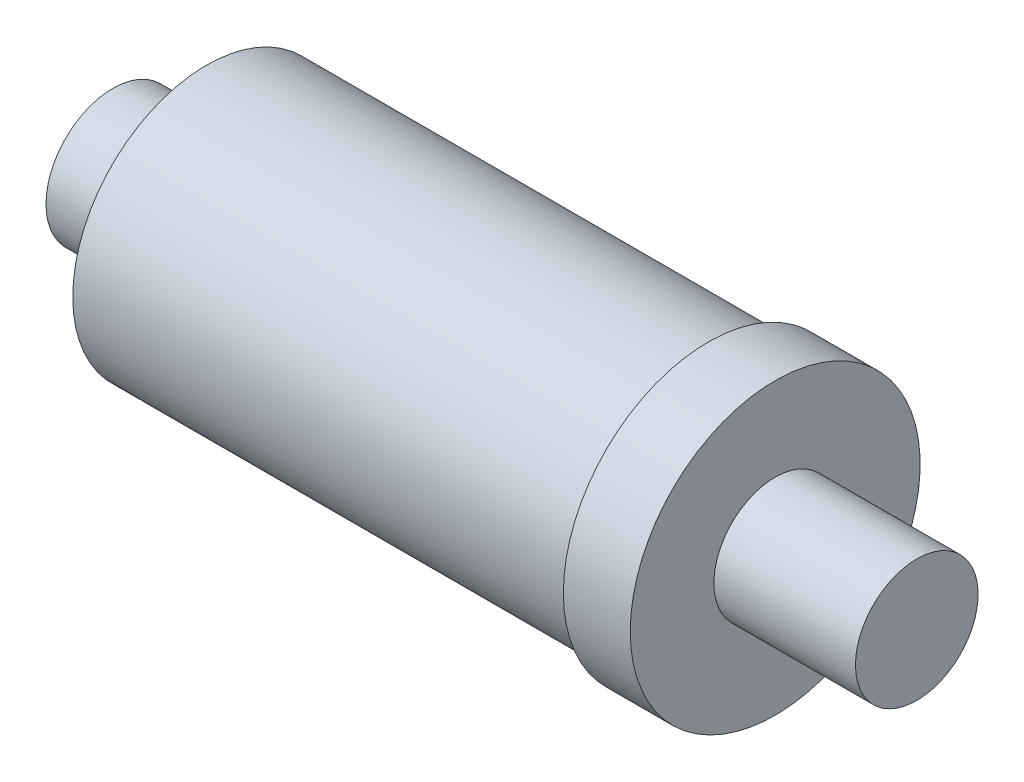
ISO-10303-21;
HEADER;
FILE_DESCRIPTION(('STEP AP214'),'2;1');
FILE_NAME('part.step','',(''),(''),'','','');
FILE_SCHEMA(('AUTOMOTIVE_DESIGN { 1 0 10303 214 1 1 1 1 }'));
ENDSEC;
DATA;
#1=APPLICATION_CONTEXT('core data for automotive mechanical design processes');
#2=APPLICATION_PROTOCOL_DEFINITION('international standard','automotive_design',2000,#1);
#3=PRODUCT_CONTEXT('',#1,'mechanical');
#4=PRODUCT('Part','Part','',(#3));
#5=PRODUCT_RELATED_PRODUCT_CATEGORY('part','',(#4));
#6=PRODUCT_DEFINITION_FORMATION('','',#4);
#7=PRODUCT_DEFINITION_CONTEXT('part definition',#1,'design');
#8=PRODUCT_DEFINITION('design','',#6,#7);
#9=PRODUCT_DEFINITION_SHAPE('','',#8);
#10=(LENGTH_UNIT() NAMED_UNIT(*) SI_UNIT(.MILLI.,.METRE.));
#11=(NAMED_UNIT(*) PLANE_ANGLE_UNIT() SI_UNIT($,.RADIAN.));
#12=(NAMED_UNIT(*) SI_UNIT($,.STERADIAN.) SOLID_ANGLE_UNIT());
#13=UNCERTAINTY_MEASURE_WITH_UNIT(LENGTH_MEASURE(1.E-05),#10,'distance_accuracy_value','');
#14=(GEOMETRIC_REPRESENTATION_CONTEXT(3) GLOBAL_UNCERTAINTY_ASSIGNED_CONTEXT((#13)) GLOBAL_UNIT_ASSIGNED_CONTEXT((#10,
#11,#12)) REPRESENTATION_CONTEXT('',''));
#15=CARTESIAN_POINT('',(0.,0.,0.));
#16=DIRECTION('',(0.,0.,1.));
#17=DIRECTION('',(1.,0.,0.));
#18=AXIS2_PLACEMENT_3D('',#15,#16,#17);
#19=CARTESIAN_POINT('',(12.7,0.,0.));
#20=DIRECTION('',(-1.,0.,0.));
#21=DIRECTION('',(0.,0.,1.));
#22=AXIS2_PLACEMENT_3D('',#19,#20,#21);
#23=PLANE('',#22);
#24=CARTESIAN_POINT('',(12.6999999999999,0.,0.));
#25=DIRECTION('',(-1.,0.,0.));
#26=DIRECTION('',(0.,0.,1.));
#27=AXIS2_PLACEMENT_3D('',#24,#25,#26);
#28=CIRCLE('',#27,5.5);
#29=CARTESIAN_POINT('',(12.6999999999999,0.,5.5));
#30=VERTEX_POINT('',#29);
#31=EDGE_CURVE('E10',#30,#30,#28,.T.);
#32=ORIENTED_EDGE('',*,*,#31,.F.);
#33=EDGE_LOOP('',(#32));
#34=FACE_BOUND('',#33,.T.);
#35=ADVANCED_FACE('F39',(#34),#23,.F.);
#36=CARTESIAN_POINT('',(-1000.,0.,0.));
#37=DIRECTION('',(-1.,0.,0.));
#38=DIRECTION('',(0.,0.,1.));
#39=AXIS2_PLACEMENT_3D('',#36,#37,#38);
#40=CYLINDRICAL_SURFACE('',#39,5.5);
#41=CARTESIAN_POINT('',(0.,0.,0.));
#42=DIRECTION('',(-1.,0.,0.));
#43=DIRECTION('',(0.,0.,1.));
#44=AXIS2_PLACEMENT_3D('',#41,#42,#43);
#45=CIRCLE('',#44,5.5);
#46=CARTESIAN_POINT('',(0.,0.,5.5));
#47=VERTEX_POINT('',#46);
#48=EDGE_CURVE('E44',#47,#47,#45,.T.);
#49=ORIENTED_EDGE('',*,*,#48,.F.);
#50=EDGE_LOOP('',(#49));
#51=FACE_BOUND('',#50,.T.);
#52=ORIENTED_EDGE('',*,*,#31,.T.);
#53=EDGE_LOOP('',(#52));
#54=FACE_BOUND('',#53,.T.);
#55=ADVANCED_FACE('F104',(#51,#54),#40,.T.);
#56=CARTESIAN_POINT('',(0.,5.5,0.));
#57=DIRECTION('',(-1.,0.,0.));
#58=DIRECTION('',(0.,0.,1.));
#59=AXIS2_PLACEMENT_3D('',#56,#57,#58);
#60=PLANE('',#59);
#61=CARTESIAN_POINT('',(0.,0.,0.));
#62=DIRECTION('',(-1.,0.,0.));
#63=DIRECTION('',(0.,0.,1.));
#64=AXIS2_PLACEMENT_3D('',#61,#62,#63);
#65=CIRCLE('',#64,13.);
#66=CARTESIAN_POINT('',(0.,0.,13.));
#67=VERTEX_POINT('',#66);
#68=EDGE_CURVE('E47',#67,#67,#65,.T.);
#69=ORIENTED_EDGE('',*,*,#68,.F.);
#70=EDGE_LOOP('',(#69));
#71=FACE_BOUND('',#70,.T.);
#72=ORIENTED_EDGE('',*,*,#48,.T.);
#73=EDGE_LOOP('',(#72));
#74=FACE_BOUND('',#73,.T.);
#75=ADVANCED_FACE('F99',(#71,#74),#60,.F.);
#76=CARTESIAN_POINT('',(-1000.,0.,0.));
#77=DIRECTION('',(-1.,0.,0.));
#78=DIRECTION('',(0.,0.,1.));
#79=AXIS2_PLACEMENT_3D('',#76,#77,#78);
#80=CYLINDRICAL_SURFACE('',#79,13.);
#81=CARTESIAN_POINT('',(-6.00000000000001,0.,0.));
#82=DIRECTION('',(-1.,0.,0.));
#83=DIRECTION('',(0.,0.,1.));
#84=AXIS2_PLACEMENT_3D('',#81,#82,#83);
#85=CIRCLE('',#84,13.);
#86=CARTESIAN_POINT('',(-6.00000000000001,0.,13.));
#87=VERTEX_POINT('',#86);
#88=EDGE_CURVE('E52',#87,#87,#85,.T.);
#89=ORIENTED_EDGE('',*,*,#88,.F.);
#90=EDGE_LOOP('',(#89));
#91=FACE_BOUND('',#90,.T.);
#92=ORIENTED_EDGE('',*,*,#68,.T.);
#93=EDGE_LOOP('',(#92));
#94=FACE_BOUND('',#93,.T.);
#95=ADVANCED_FACE('F94',(#91,#94),#80,.T.);
#96=CARTESIAN_POINT('',(-6.,13.,0.));
#97=DIRECTION('',(1.,0.,0.));
#98=DIRECTION('',(0.,0.,-1.));
#99=AXIS2_PLACEMENT_3D('',#96,#97,#98);
#100=PLANE('',#99);
#101=CARTESIAN_POINT('',(-6.00000000000001,0.,0.));
#102=DIRECTION('',(-1.,0.,0.));
#103=DIRECTION('',(0.,0.,1.));
#104=AXIS2_PLACEMENT_3D('',#101,#102,#103);
#105=CIRCLE('',#104,12.);
#106=CARTESIAN_POINT('',(-6.00000000000001,0.,12.));
#107=VERTEX_POINT('',#106);
#108=EDGE_CURVE('E59',#107,#107,#105,.T.);
#109=ORIENTED_EDGE('',*,*,#108,.F.);
#110=EDGE_LOOP('',(#109));
#111=FACE_BOUND('',#110,.T.);
#112=ORIENTED_EDGE('',*,*,#88,.T.);
#113=EDGE_LOOP('',(#112));
#114=FACE_BOUND('',#113,.T.);
#115=ADVANCED_FACE('F86',(#111,#114),#100,.F.);
#116=CARTESIAN_POINT('',(-1000.,0.,0.));
#117=DIRECTION('',(-1.,0.,0.));
#118=DIRECTION('',(0.,0.,1.));
#119=AXIS2_PLACEMENT_3D('',#116,#117,#118);
#120=CYLINDRICAL_SURFACE('',#119,12.);
#121=CARTESIAN_POINT('',(-51.,0.,0.));
#122=DIRECTION('',(-1.,0.,0.));
#123=DIRECTION('',(0.,0.,1.));
#124=AXIS2_PLACEMENT_3D('',#121,#122,#123);
#125=CIRCLE('',#124,12.);
#126=CARTESIAN_POINT('',(-51.,0.,12.));
#127=VERTEX_POINT('',#126);
#128=EDGE_CURVE('E62',#127,#127,#125,.T.);
#129=ORIENTED_EDGE('',*,*,#128,.F.);
#130=EDGE_LOOP('',(#129));
#131=FACE_BOUND('',#130,.T.);
#132=ORIENTED_EDGE('',*,*,#108,.T.);
#133=EDGE_LOOP('',(#132));
#134=FACE_BOUND('',#133,.T.);
#135=ADVANCED_FACE('F82',(#131,#134),#120,.T.);
#136=CARTESIAN_POINT('',(-51.,12.,0.));
#137=DIRECTION('',(1.,0.,0.));
#138=DIRECTION('',(0.,0.,-1.));
#139=AXIS2_PLACEMENT_3D('',#136,#137,#138);
#140=PLANE('',#139);
#141=CARTESIAN_POINT('',(-51.,0.,0.));
#142=DIRECTION('',(-1.,0.,0.));
#143=DIRECTION('',(0.,0.,1.));
#144=AXIS2_PLACEMENT_3D('',#141,#142,#143);
#145=CIRCLE('',#144,6.);
#146=CARTESIAN_POINT('',(-51.,0.,6.));
#147=VERTEX_POINT('',#146);
#148=EDGE_CURVE('E61',#147,#147,#145,.T.);
#149=ORIENTED_EDGE('',*,*,#148,.F.);
#150=EDGE_LOOP('',(#149));
#151=FACE_BOUND('',#150,.T.);
#152=ORIENTED_EDGE('',*,*,#128,.T.);
#153=EDGE_LOOP('',(#152));
#154=FACE_BOUND('',#153,.T.);
#155=ADVANCED_FACE('F77',(#151,#154),#140,.F.);
#156=CARTESIAN_POINT('',(-1000.,0.,0.));
#157=DIRECTION('',(-1.,0.,0.));
#158=DIRECTION('',(0.,0.,1.));
#159=AXIS2_PLACEMENT_3D('',#156,#157,#158);
#160=CYLINDRICAL_SURFACE('',#159,6.);
#161=CARTESIAN_POINT('',(-59.4,0.,0.));
#162=DIRECTION('',(-1.,0.,0.));
#163=DIRECTION('',(0.,0.,1.));
#164=AXIS2_PLACEMENT_3D('',#161,#162,#163);
#165=CIRCLE('',#164,6.);
#166=CARTESIAN_POINT('',(-59.4,0.,6.));
#167=VERTEX_POINT('',#166);
#168=EDGE_CURVE('E67',#167,#167,#165,.T.);
#169=ORIENTED_EDGE('',*,*,#168,.F.);
#170=EDGE_LOOP('',(#169));
#171=FACE_BOUND('',#170,.T.);
#172=ORIENTED_EDGE('',*,*,#148,.T.);
#173=EDGE_LOOP('',(#172));
#174=FACE_BOUND('',#173,.T.);
#175=ADVANCED_FACE('F71',(#171,#174),#160,.T.);
#176=CARTESIAN_POINT('',(-59.4,6.,0.));
#177=DIRECTION('',(1.,0.,0.));
#178=DIRECTION('',(0.,0.,-1.));
#179=AXIS2_PLACEMENT_3D('',#176,#177,#178);
#180=PLANE('',#179);
#181=ORIENTED_EDGE('',*,*,#168,.T.);
#182=EDGE_LOOP('',(#181));
#183=FACE_BOUND('',#182,.T.);
#184=ADVANCED_FACE('F72',(#183),#180,.F.);
#185=CLOSED_SHELL('',(#35,#55,#75,#95,#115,#135,#155,#175,#184));
#186=MANIFOLD_SOLID_BREP('B2',#185);
#187=ADVANCED_BREP_SHAPE_REPRESENTATION('',(#18,#186),#14);
#188=SHAPE_DEFINITION_REPRESENTATION(#9,#187);
ENDSEC;
END-ISO-10303-21;
